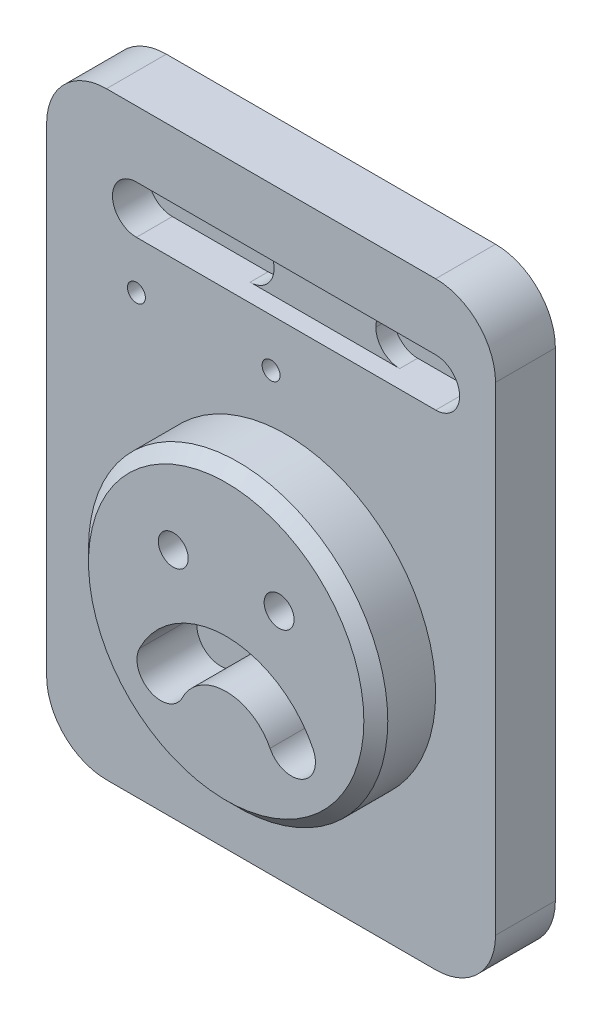
ISO-10303-21;
HEADER;
FILE_DESCRIPTION(('STEP AP214'),'2;1');
FILE_NAME('part.step','',(''),(''),'','','');
FILE_SCHEMA(('AUTOMOTIVE_DESIGN { 1 0 10303 214 1 1 1 1 }'));
ENDSEC;
DATA;
#1=APPLICATION_CONTEXT('core data for automotive mechanical design processes');
#2=APPLICATION_PROTOCOL_DEFINITION('international standard','automotive_design',2000,#1);
#3=PRODUCT_CONTEXT('',#1,'mechanical');
#4=PRODUCT('Part','Part','',(#3));
#5=PRODUCT_RELATED_PRODUCT_CATEGORY('part','',(#4));
#6=PRODUCT_DEFINITION_FORMATION('','',#4);
#7=PRODUCT_DEFINITION_CONTEXT('part definition',#1,'design');
#8=PRODUCT_DEFINITION('design','',#6,#7);
#9=PRODUCT_DEFINITION_SHAPE('','',#8);
#10=(LENGTH_UNIT() NAMED_UNIT(*) SI_UNIT(.MILLI.,.METRE.));
#11=(NAMED_UNIT(*) PLANE_ANGLE_UNIT() SI_UNIT($,.RADIAN.));
#12=(NAMED_UNIT(*) SI_UNIT($,.STERADIAN.) SOLID_ANGLE_UNIT());
#13=UNCERTAINTY_MEASURE_WITH_UNIT(LENGTH_MEASURE(1.E-05),#10,'distance_accuracy_value','');
#14=(GEOMETRIC_REPRESENTATION_CONTEXT(3) GLOBAL_UNCERTAINTY_ASSIGNED_CONTEXT((#13)) GLOBAL_UNIT_ASSIGNED_CONTEXT((#10,
#11,#12)) REPRESENTATION_CONTEXT('',''));
#15=CARTESIAN_POINT('',(0.,0.,0.));
#16=DIRECTION('',(0.,0.,1.));
#17=DIRECTION('',(1.,0.,0.));
#18=AXIS2_PLACEMENT_3D('',#15,#16,#17);
#19=CARTESIAN_POINT('',(15.,89.,4.));
#20=DIRECTION('',(0.,1.,0.));
#21=DIRECTION('',(-1.,0.,0.));
#22=AXIS2_PLACEMENT_3D('',#19,#20,#21);
#23=PLANE('',#22);
#24=DIRECTION('',(-1.,0.,0.));
#25=VECTOR('',#24,1.);
#26=CARTESIAN_POINT('',(35.,89.,7.));
#27=LINE('',#26,#25);
#28=CARTESIAN_POINT('',(56.,89.,7.));
#29=VERTEX_POINT('',#28);
#30=CARTESIAN_POINT('',(31.,89.,7.));
#31=VERTEX_POINT('',#30);
#32=EDGE_CURVE('E242',#29,#31,#27,.T.);
#33=ORIENTED_EDGE('',*,*,#32,.F.);
#34=DIRECTION('',(0.,0.,-1.));
#35=VECTOR('',#34,1.);
#36=CARTESIAN_POINT('',(56.,89.,4.));
#37=LINE('',#36,#35);
#38=CARTESIAN_POINT('',(56.,89.,4.));
#39=VERTEX_POINT('',#38);
#40=EDGE_CURVE('E388',#29,#39,#37,.T.);
#41=ORIENTED_EDGE('',*,*,#40,.T.);
#42=DIRECTION('',(-1.,0.,0.));
#43=VECTOR('',#42,1.);
#44=CARTESIAN_POINT('',(15.,89.,4.));
#45=LINE('',#44,#43);
#46=CARTESIAN_POINT('',(65.,89.,4.));
#47=VERTEX_POINT('',#46);
#48=EDGE_CURVE('E272',#47,#39,#45,.T.);
#49=ORIENTED_EDGE('',*,*,#48,.F.);
#50=DIRECTION('',(0.,0.,1.));
#51=VECTOR('',#50,1.);
#52=CARTESIAN_POINT('',(65.,89.,4.));
#53=LINE('',#52,#51);
#54=CARTESIAN_POINT('',(65.,89.,10.));
#55=VERTEX_POINT('',#54);
#56=EDGE_CURVE('E292',#47,#55,#53,.T.);
#57=ORIENTED_EDGE('',*,*,#56,.T.);
#58=DIRECTION('',(-1.,0.,0.));
#59=VECTOR('',#58,1.);
#60=CARTESIAN_POINT('',(15.,89.,10.));
#61=LINE('',#60,#59);
#62=CARTESIAN_POINT('',(15.,89.,10.));
#63=VERTEX_POINT('',#62);
#64=EDGE_CURVE('E264',#55,#63,#61,.T.);
#65=ORIENTED_EDGE('',*,*,#64,.T.);
#66=DIRECTION('',(0.,0.,1.));
#67=VECTOR('',#66,1.);
#68=CARTESIAN_POINT('',(15.,89.,4.));
#69=LINE('',#68,#67);
#70=CARTESIAN_POINT('',(15.,89.,4.));
#71=VERTEX_POINT('',#70);
#72=EDGE_CURVE('E289',#71,#63,#69,.T.);
#73=ORIENTED_EDGE('',*,*,#72,.F.);
#74=CARTESIAN_POINT('',(31.,89.,4.));
#75=VERTEX_POINT('',#74);
#76=EDGE_CURVE('E271',#75,#71,#45,.T.);
#77=ORIENTED_EDGE('',*,*,#76,.F.);
#78=DIRECTION('',(0.,0.,-1.));
#79=VECTOR('',#78,1.);
#80=CARTESIAN_POINT('',(31.,89.,7.));
#81=LINE('',#80,#79);
#82=EDGE_CURVE('E385',#75,#31,#81,.F.);
#83=ORIENTED_EDGE('',*,*,#82,.T.);
#84=EDGE_LOOP('',(#33,#41,#49,#57,#65,#73,#77,#83));
#85=FACE_BOUND('',#84,.T.);
#86=ADVANCED_FACE('F45',(#85),#23,.F.);
#87=CARTESIAN_POINT('',(15.,81.,4.));
#88=DIRECTION('',(0.,-1.,0.));
#89=DIRECTION('',(0.,0.,-1.));
#90=AXIS2_PLACEMENT_3D('',#87,#88,#89);
#91=PLANE('',#90);
#92=DIRECTION('',(1.,0.,0.));
#93=VECTOR('',#92,1.);
#94=CARTESIAN_POINT('',(15.,81.,4.));
#95=LINE('',#94,#93);
#96=CARTESIAN_POINT('',(56.,81.,4.));
#97=VERTEX_POINT('',#96);
#98=CARTESIAN_POINT('',(65.,81.,4.));
#99=VERTEX_POINT('',#98);
#100=EDGE_CURVE('E263',#97,#99,#95,.T.);
#101=ORIENTED_EDGE('',*,*,#100,.F.);
#102=DIRECTION('',(0.,0.,-1.));
#103=VECTOR('',#102,1.);
#104=CARTESIAN_POINT('',(56.,81.,7.));
#105=LINE('',#104,#103);
#106=CARTESIAN_POINT('',(56.,81.,7.));
#107=VERTEX_POINT('',#106);
#108=EDGE_CURVE('E382',#97,#107,#105,.F.);
#109=ORIENTED_EDGE('',*,*,#108,.T.);
#110=DIRECTION('',(1.,0.,0.));
#111=VECTOR('',#110,1.);
#112=CARTESIAN_POINT('',(35.,81.,7.));
#113=LINE('',#112,#111);
#114=CARTESIAN_POINT('',(31.,81.,7.));
#115=VERTEX_POINT('',#114);
#116=EDGE_CURVE('E240',#115,#107,#113,.T.);
#117=ORIENTED_EDGE('',*,*,#116,.F.);
#118=DIRECTION('',(0.,0.,-1.));
#119=VECTOR('',#118,1.);
#120=CARTESIAN_POINT('',(31.,81.,4.));
#121=LINE('',#120,#119);
#122=CARTESIAN_POINT('',(31.,81.,4.));
#123=VERTEX_POINT('',#122);
#124=EDGE_CURVE('E379',#115,#123,#121,.T.);
#125=ORIENTED_EDGE('',*,*,#124,.T.);
#126=CARTESIAN_POINT('',(15.,81.,4.));
#127=VERTEX_POINT('',#126);
#128=EDGE_CURVE('E265',#127,#123,#95,.T.);
#129=ORIENTED_EDGE('',*,*,#128,.F.);
#130=DIRECTION('',(0.,0.,1.));
#131=VECTOR('',#130,1.);
#132=CARTESIAN_POINT('',(15.,81.,4.));
#133=LINE('',#132,#131);
#134=CARTESIAN_POINT('',(15.,81.,10.));
#135=VERTEX_POINT('',#134);
#136=EDGE_CURVE('E275',#127,#135,#133,.T.);
#137=ORIENTED_EDGE('',*,*,#136,.T.);
#138=DIRECTION('',(1.,0.,0.));
#139=VECTOR('',#138,1.);
#140=CARTESIAN_POINT('',(15.,81.,10.));
#141=LINE('',#140,#139);
#142=CARTESIAN_POINT('',(65.,81.,10.));
#143=VERTEX_POINT('',#142);
#144=EDGE_CURVE('E278',#135,#143,#141,.T.);
#145=ORIENTED_EDGE('',*,*,#144,.T.);
#146=DIRECTION('',(0.,0.,1.));
#147=VECTOR('',#146,1.);
#148=CARTESIAN_POINT('',(65.,81.,4.));
#149=LINE('',#148,#147);
#150=EDGE_CURVE('E294',#99,#143,#149,.T.);
#151=ORIENTED_EDGE('',*,*,#150,.F.);
#152=EDGE_LOOP('',(#101,#109,#117,#125,#129,#137,#145,#151));
#153=FACE_BOUND('',#152,.T.);
#154=ADVANCED_FACE('F425',(#153),#91,.F.);
#155=CARTESIAN_POINT('',(15.,85.,4.));
#156=DIRECTION('',(0.,0.,1.));
#157=DIRECTION('',(1.,0.,0.));
#158=AXIS2_PLACEMENT_3D('',#155,#156,#157);
#159=PLANE('',#158);
#160=ORIENTED_EDGE('',*,*,#128,.T.);
#161=CARTESIAN_POINT('',(31.,85.,4.));
#162=DIRECTION('',(0.,0.,1.));
#163=DIRECTION('',(1.,0.,0.));
#164=AXIS2_PLACEMENT_3D('',#161,#162,#163);
#165=CIRCLE('',#164,4.);
#166=CARTESIAN_POINT('',(35.,85.,4.));
#167=VERTEX_POINT('',#166);
#168=EDGE_CURVE('E392',#123,#167,#165,.T.);
#169=ORIENTED_EDGE('',*,*,#168,.T.);
#170=CARTESIAN_POINT('',(31.,85.,4.));
#171=DIRECTION('',(0.,0.,1.));
#172=DIRECTION('',(1.,0.,0.));
#173=AXIS2_PLACEMENT_3D('',#170,#171,#172);
#174=CIRCLE('',#173,4.);
#175=EDGE_CURVE('E390',#167,#75,#174,.T.);
#176=ORIENTED_EDGE('',*,*,#175,.T.);
#177=ORIENTED_EDGE('',*,*,#76,.T.);
#178=CARTESIAN_POINT('',(15.,85.,4.));
#179=DIRECTION('',(0.,0.,1.));
#180=DIRECTION('',(1.,0.,0.));
#181=AXIS2_PLACEMENT_3D('',#178,#179,#180);
#182=CIRCLE('',#181,3.99999999999999);
#183=EDGE_CURVE('E260',#71,#127,#182,.T.);
#184=ORIENTED_EDGE('',*,*,#183,.T.);
#185=EDGE_LOOP('',(#160,#169,#176,#177,#184));
#186=FACE_BOUND('',#185,.T.);
#187=ADVANCED_FACE('F431',(#186),#159,.T.);
#188=CARTESIAN_POINT('',(56.,85.,4.));
#189=DIRECTION('',(0.,0.,1.));
#190=DIRECTION('',(1.,0.,0.));
#191=AXIS2_PLACEMENT_3D('',#188,#189,#190);
#192=CIRCLE('',#191,4.);
#193=CARTESIAN_POINT('',(52.,85.,4.));
#194=VERTEX_POINT('',#193);
#195=EDGE_CURVE('E375',#39,#194,#192,.T.);
#196=ORIENTED_EDGE('',*,*,#195,.T.);
#197=CARTESIAN_POINT('',(56.,85.,4.));
#198=DIRECTION('',(0.,0.,1.));
#199=DIRECTION('',(1.,0.,0.));
#200=AXIS2_PLACEMENT_3D('',#197,#198,#199);
#201=CIRCLE('',#200,4.);
#202=EDGE_CURVE('E377',#194,#97,#201,.T.);
#203=ORIENTED_EDGE('',*,*,#202,.T.);
#204=ORIENTED_EDGE('',*,*,#100,.T.);
#205=CARTESIAN_POINT('',(65.,85.,4.));
#206=DIRECTION('',(0.,0.,1.));
#207=DIRECTION('',(1.,0.,0.));
#208=AXIS2_PLACEMENT_3D('',#205,#206,#207);
#209=CIRCLE('',#208,4.);
#210=EDGE_CURVE('E268',#99,#47,#209,.T.);
#211=ORIENTED_EDGE('',*,*,#210,.T.);
#212=ORIENTED_EDGE('',*,*,#48,.T.);
#213=EDGE_LOOP('',(#196,#203,#204,#211,#212));
#214=FACE_BOUND('',#213,.T.);
#215=ADVANCED_FACE('F483',(#214),#159,.T.);
#216=CARTESIAN_POINT('',(0.,0.,10.));
#217=DIRECTION('',(1.,0.,0.));
#218=DIRECTION('',(0.,0.,-1.));
#219=AXIS2_PLACEMENT_3D('',#216,#217,#218);
#220=PLANE('',#219);
#221=DIRECTION('',(0.,-1.,0.));
#222=VECTOR('',#221,1.);
#223=CARTESIAN_POINT('',(0.,0.,0.));
#224=LINE('',#223,#222);
#225=CARTESIAN_POINT('',(0.,90.,0.));
#226=VERTEX_POINT('',#225);
#227=CARTESIAN_POINT('',(0.,10.,0.));
#228=VERTEX_POINT('',#227);
#229=EDGE_CURVE('E311',#226,#228,#224,.T.);
#230=ORIENTED_EDGE('',*,*,#229,.T.);
#231=DIRECTION('',(0.,0.,-1.));
#232=VECTOR('',#231,1.);
#233=CARTESIAN_POINT('',(0.,10.,10.));
#234=LINE('',#233,#232);
#235=CARTESIAN_POINT('',(0.,10.,10.));
#236=VERTEX_POINT('',#235);
#237=EDGE_CURVE('E351',#228,#236,#234,.F.);
#238=ORIENTED_EDGE('',*,*,#237,.T.);
#239=DIRECTION('',(0.,-1.,0.));
#240=VECTOR('',#239,1.);
#241=CARTESIAN_POINT('',(0.,0.,10.));
#242=LINE('',#241,#240);
#243=CARTESIAN_POINT('',(0.,90.,10.));
#244=VERTEX_POINT('',#243);
#245=EDGE_CURVE('E317',#244,#236,#242,.T.);
#246=ORIENTED_EDGE('',*,*,#245,.F.);
#247=DIRECTION('',(0.,0.,-1.));
#248=VECTOR('',#247,1.);
#249=CARTESIAN_POINT('',(0.,90.,10.));
#250=LINE('',#249,#248);
#251=EDGE_CURVE('E348',#244,#226,#250,.T.);
#252=ORIENTED_EDGE('',*,*,#251,.T.);
#253=EDGE_LOOP('',(#230,#238,#246,#252));
#254=FACE_BOUND('',#253,.T.);
#255=ADVANCED_FACE('F479',(#254),#220,.F.);
#256=CARTESIAN_POINT('',(0.,0.,10.));
#257=DIRECTION('',(0.,1.,0.));
#258=DIRECTION('',(0.,0.,1.));
#259=AXIS2_PLACEMENT_3D('',#256,#257,#258);
#260=PLANE('',#259);
#261=DIRECTION('',(1.,0.,0.));
#262=VECTOR('',#261,1.);
#263=CARTESIAN_POINT('',(0.,0.,10.));
#264=LINE('',#263,#262);
#265=CARTESIAN_POINT('',(10.,0.,10.));
#266=VERTEX_POINT('',#265);
#267=CARTESIAN_POINT('',(65.,0.,10.));
#268=VERTEX_POINT('',#267);
#269=EDGE_CURVE('E321',#266,#268,#264,.T.);
#270=ORIENTED_EDGE('',*,*,#269,.F.);
#271=DIRECTION('',(0.,0.,-1.));
#272=VECTOR('',#271,1.);
#273=CARTESIAN_POINT('',(10.,0.,10.));
#274=LINE('',#273,#272);
#275=CARTESIAN_POINT('',(10.,0.,0.));
#276=VERTEX_POINT('',#275);
#277=EDGE_CURVE('E332',#266,#276,#274,.T.);
#278=ORIENTED_EDGE('',*,*,#277,.T.);
#279=DIRECTION('',(1.,0.,0.));
#280=VECTOR('',#279,1.);
#281=CARTESIAN_POINT('',(0.,0.,0.));
#282=LINE('',#281,#280);
#283=CARTESIAN_POINT('',(65.,0.,0.));
#284=VERTEX_POINT('',#283);
#285=EDGE_CURVE('E557',#276,#284,#282,.T.);
#286=ORIENTED_EDGE('',*,*,#285,.T.);
#287=DIRECTION('',(0.,0.,-1.));
#288=VECTOR('',#287,1.);
#289=CARTESIAN_POINT('',(65.,0.,10.));
#290=LINE('',#289,#288);
#291=EDGE_CURVE('E315',#284,#268,#290,.F.);
#292=ORIENTED_EDGE('',*,*,#291,.T.);
#293=EDGE_LOOP('',(#270,#278,#286,#292));
#294=FACE_BOUND('',#293,.T.);
#295=ADVANCED_FACE('F475',(#294),#260,.F.);
#296=CARTESIAN_POINT('',(75.,0.,10.));
#297=DIRECTION('',(-1.,0.,0.));
#298=DIRECTION('',(0.,0.,1.));
#299=AXIS2_PLACEMENT_3D('',#296,#297,#298);
#300=PLANE('',#299);
#301=DIRECTION('',(0.,1.,0.));
#302=VECTOR('',#301,1.);
#303=CARTESIAN_POINT('',(75.,0.,10.));
#304=LINE('',#303,#302);
#305=CARTESIAN_POINT('',(75.,10.,10.));
#306=VERTEX_POINT('',#305);
#307=CARTESIAN_POINT('',(75.,90.,10.));
#308=VERTEX_POINT('',#307);
#309=EDGE_CURVE('E327',#306,#308,#304,.T.);
#310=ORIENTED_EDGE('',*,*,#309,.F.);
#311=DIRECTION('',(0.,0.,-1.));
#312=VECTOR('',#311,1.);
#313=CARTESIAN_POINT('',(75.,10.,10.));
#314=LINE('',#313,#312);
#315=CARTESIAN_POINT('',(75.,10.,0.));
#316=VERTEX_POINT('',#315);
#317=EDGE_CURVE('E367',#306,#316,#314,.T.);
#318=ORIENTED_EDGE('',*,*,#317,.T.);
#319=DIRECTION('',(0.,1.,0.));
#320=VECTOR('',#319,1.);
#321=CARTESIAN_POINT('',(75.,0.,0.));
#322=LINE('',#321,#320);
#323=CARTESIAN_POINT('',(75.,90.,0.));
#324=VERTEX_POINT('',#323);
#325=EDGE_CURVE('E563',#316,#324,#322,.T.);
#326=ORIENTED_EDGE('',*,*,#325,.T.);
#327=DIRECTION('',(0.,0.,-1.));
#328=VECTOR('',#327,1.);
#329=CARTESIAN_POINT('',(75.,90.,10.));
#330=LINE('',#329,#328);
#331=EDGE_CURVE('E365',#324,#308,#330,.F.);
#332=ORIENTED_EDGE('',*,*,#331,.T.);
#333=EDGE_LOOP('',(#310,#318,#326,#332));
#334=FACE_BOUND('',#333,.T.);
#335=ADVANCED_FACE('F471',(#334),#300,.F.);
#336=CARTESIAN_POINT('',(0.,100.,10.));
#337=DIRECTION('',(0.,-1.,0.));
#338=DIRECTION('',(0.,0.,-1.));
#339=AXIS2_PLACEMENT_3D('',#336,#337,#338);
#340=PLANE('',#339);
#341=DIRECTION('',(-1.,0.,0.));
#342=VECTOR('',#341,1.);
#343=CARTESIAN_POINT('',(0.,100.,10.));
#344=LINE('',#343,#342);
#345=CARTESIAN_POINT('',(65.,100.,10.));
#346=VERTEX_POINT('',#345);
#347=CARTESIAN_POINT('',(10.,100.,10.));
#348=VERTEX_POINT('',#347);
#349=EDGE_CURVE('E316',#346,#348,#344,.T.);
#350=ORIENTED_EDGE('',*,*,#349,.F.);
#351=DIRECTION('',(0.,0.,-1.));
#352=VECTOR('',#351,1.);
#353=CARTESIAN_POINT('',(65.,100.,10.));
#354=LINE('',#353,#352);
#355=CARTESIAN_POINT('',(65.,100.,0.));
#356=VERTEX_POINT('',#355);
#357=EDGE_CURVE('E372',#346,#356,#354,.T.);
#358=ORIENTED_EDGE('',*,*,#357,.T.);
#359=DIRECTION('',(-1.,0.,0.));
#360=VECTOR('',#359,1.);
#361=CARTESIAN_POINT('',(0.,100.,0.));
#362=LINE('',#361,#360);
#363=CARTESIAN_POINT('',(10.,100.,0.));
#364=VERTEX_POINT('',#363);
#365=EDGE_CURVE('E322',#356,#364,#362,.T.);
#366=ORIENTED_EDGE('',*,*,#365,.T.);
#367=DIRECTION('',(0.,0.,-1.));
#368=VECTOR('',#367,1.);
#369=CARTESIAN_POINT('',(10.,100.,10.));
#370=LINE('',#369,#368);
#371=EDGE_CURVE('E370',#364,#348,#370,.F.);
#372=ORIENTED_EDGE('',*,*,#371,.T.);
#373=EDGE_LOOP('',(#350,#358,#366,#372));
#374=FACE_BOUND('',#373,.T.);
#375=ADVANCED_FACE('F464',(#374),#340,.F.);
#376=CARTESIAN_POINT('',(0.,0.,10.));
#377=DIRECTION('',(0.,0.,-1.));
#378=DIRECTION('',(-1.,0.,0.));
#379=AXIS2_PLACEMENT_3D('',#376,#377,#378);
#380=PLANE('',#379);
#381=CARTESIAN_POINT('',(15.,73.,10.));
#382=DIRECTION('',(0.,0.,1.));
#383=DIRECTION('',(1.,0.,0.));
#384=AXIS2_PLACEMENT_3D('',#381,#382,#383);
#385=CIRCLE('',#384,1.5);
#386=CARTESIAN_POINT('',(16.5,73.,10.));
#387=VERTEX_POINT('',#386);
#388=EDGE_CURVE('E245',#387,#387,#385,.T.);
#389=ORIENTED_EDGE('',*,*,#388,.F.);
#390=EDGE_LOOP('',(#389));
#391=FACE_BOUND('',#390,.T.);
#392=CARTESIAN_POINT('',(37.5,73.,10.));
#393=DIRECTION('',(0.,0.,1.));
#394=DIRECTION('',(1.,0.,0.));
#395=AXIS2_PLACEMENT_3D('',#392,#393,#394);
#396=CIRCLE('',#395,1.5);
#397=CARTESIAN_POINT('',(39.,73.,10.));
#398=VERTEX_POINT('',#397);
#399=EDGE_CURVE('E252',#398,#398,#396,.T.);
#400=ORIENTED_EDGE('',*,*,#399,.F.);
#401=EDGE_LOOP('',(#400));
#402=FACE_BOUND('',#401,.T.);
#403=ORIENTED_EDGE('',*,*,#144,.F.);
#404=CARTESIAN_POINT('',(15.,85.,10.));
#405=DIRECTION('',(0.,0.,1.));
#406=DIRECTION('',(1.,0.,0.));
#407=AXIS2_PLACEMENT_3D('',#404,#405,#406);
#408=CIRCLE('',#407,3.99999999999999);
#409=EDGE_CURVE('E259',#63,#135,#408,.T.);
#410=ORIENTED_EDGE('',*,*,#409,.F.);
#411=ORIENTED_EDGE('',*,*,#64,.F.);
#412=CARTESIAN_POINT('',(65.,85.,10.));
#413=DIRECTION('',(0.,0.,1.));
#414=DIRECTION('',(1.,0.,0.));
#415=AXIS2_PLACEMENT_3D('',#412,#413,#414);
#416=CIRCLE('',#415,4.);
#417=EDGE_CURVE('E282',#143,#55,#416,.T.);
#418=ORIENTED_EDGE('',*,*,#417,.F.);
#419=EDGE_LOOP('',(#403,#410,#411,#418));
#420=FACE_BOUND('',#419,.T.);
#421=CARTESIAN_POINT('',(40.,40.,10.));
#422=DIRECTION('',(0.,0.,1.));
#423=DIRECTION('',(1.,0.,0.));
#424=AXIS2_PLACEMENT_3D('',#421,#422,#423);
#425=CIRCLE('',#424,25.);
#426=CARTESIAN_POINT('',(65.,40.,10.));
#427=VERTEX_POINT('',#426);
#428=EDGE_CURVE('E312',#427,#427,#425,.T.);
#429=ORIENTED_EDGE('',*,*,#428,.F.);
#430=EDGE_LOOP('',(#429));
#431=FACE_BOUND('',#430,.T.);
#432=ORIENTED_EDGE('',*,*,#245,.T.);
#433=CARTESIAN_POINT('',(10.,10.,10.));
#434=DIRECTION('',(0.,0.,-1.));
#435=DIRECTION('',(-1.,0.,0.));
#436=AXIS2_PLACEMENT_3D('',#433,#434,#435);
#437=CIRCLE('',#436,10.);
#438=EDGE_CURVE('E362',#236,#266,#437,.F.);
#439=ORIENTED_EDGE('',*,*,#438,.T.);
#440=ORIENTED_EDGE('',*,*,#269,.T.);
#441=CARTESIAN_POINT('',(65.,10.,10.));
#442=DIRECTION('',(0.,0.,-1.));
#443=DIRECTION('',(-1.,0.,0.));
#444=AXIS2_PLACEMENT_3D('',#441,#442,#443);
#445=CIRCLE('',#444,10.);
#446=EDGE_CURVE('E359',#268,#306,#445,.F.);
#447=ORIENTED_EDGE('',*,*,#446,.T.);
#448=ORIENTED_EDGE('',*,*,#309,.T.);
#449=CARTESIAN_POINT('',(65.,90.,10.));
#450=DIRECTION('',(0.,0.,-1.));
#451=DIRECTION('',(-1.,0.,0.));
#452=AXIS2_PLACEMENT_3D('',#449,#450,#451);
#453=CIRCLE('',#452,10.);
#454=EDGE_CURVE('E356',#308,#346,#453,.F.);
#455=ORIENTED_EDGE('',*,*,#454,.T.);
#456=ORIENTED_EDGE('',*,*,#349,.T.);
#457=CARTESIAN_POINT('',(10.,90.,10.));
#458=DIRECTION('',(0.,0.,-1.));
#459=DIRECTION('',(-1.,0.,0.));
#460=AXIS2_PLACEMENT_3D('',#457,#458,#459);
#461=CIRCLE('',#460,10.);
#462=EDGE_CURVE('E353',#348,#244,#461,.F.);
#463=ORIENTED_EDGE('',*,*,#462,.T.);
#464=EDGE_LOOP('',(#432,#439,#440,#447,#448,#455,#456,#463));
#465=FACE_BOUND('',#464,.T.);
#466=ADVANCED_FACE('F461',(#391,#402,#420,#431,#465),#380,.F.);
#467=CARTESIAN_POINT('',(0.,0.,0.));
#468=DIRECTION('',(0.,0.,-1.));
#469=DIRECTION('',(-1.,0.,0.));
#470=AXIS2_PLACEMENT_3D('',#467,#468,#469);
#471=PLANE('',#470);
#472=CARTESIAN_POINT('',(15.,73.,0.));
#473=DIRECTION('',(0.,0.,1.));
#474=DIRECTION('',(1.,0.,0.));
#475=AXIS2_PLACEMENT_3D('',#472,#473,#474);
#476=CIRCLE('',#475,1.5);
#477=CARTESIAN_POINT('',(16.5,73.,0.));
#478=VERTEX_POINT('',#477);
#479=EDGE_CURVE('E249',#478,#478,#476,.T.);
#480=ORIENTED_EDGE('',*,*,#479,.T.);
#481=EDGE_LOOP('',(#480));
#482=FACE_BOUND('',#481,.T.);
#483=CARTESIAN_POINT('',(37.5,73.,0.));
#484=DIRECTION('',(0.,0.,1.));
#485=DIRECTION('',(1.,0.,0.));
#486=AXIS2_PLACEMENT_3D('',#483,#484,#485);
#487=CIRCLE('',#486,1.49999999999999);
#488=CARTESIAN_POINT('',(39.,73.,0.));
#489=VERTEX_POINT('',#488);
#490=EDGE_CURVE('E256',#489,#489,#487,.T.);
#491=ORIENTED_EDGE('',*,*,#490,.T.);
#492=EDGE_LOOP('',(#491));
#493=FACE_BOUND('',#492,.T.);
#494=CARTESIAN_POINT('',(31.1611652351681,48.8388347648318,0.));
#495=DIRECTION('',(0.,0.,1.));
#496=DIRECTION('',(1.,0.,0.));
#497=AXIS2_PLACEMENT_3D('',#494,#495,#496);
#498=CIRCLE('',#497,2.5);
#499=CARTESIAN_POINT('',(33.6611652351681,48.8388347648318,0.));
#500=VERTEX_POINT('',#499);
#501=EDGE_CURVE('E301',#500,#500,#498,.T.);
#502=ORIENTED_EDGE('',*,*,#501,.T.);
#503=EDGE_LOOP('',(#502));
#504=FACE_BOUND('',#503,.T.);
#505=CARTESIAN_POINT('',(48.8388347648318,48.8388347648319,0.));
#506=DIRECTION('',(0.,0.,1.));
#507=DIRECTION('',(1.,0.,0.));
#508=AXIS2_PLACEMENT_3D('',#505,#506,#507);
#509=CIRCLE('',#508,2.5);
#510=CARTESIAN_POINT('',(51.3388347648318,48.8388347648319,0.));
#511=VERTEX_POINT('',#510);
#512=EDGE_CURVE('E308',#511,#511,#509,.T.);
#513=ORIENTED_EDGE('',*,*,#512,.T.);
#514=EDGE_LOOP('',(#513));
#515=FACE_BOUND('',#514,.T.);
#516=ORIENTED_EDGE('',*,*,#285,.F.);
#517=CARTESIAN_POINT('',(10.,10.,0.));
#518=DIRECTION('',(0.,0.,-1.));
#519=DIRECTION('',(-1.,0.,0.));
#520=AXIS2_PLACEMENT_3D('',#517,#518,#519);
#521=CIRCLE('',#520,10.);
#522=EDGE_CURVE('E346',#276,#228,#521,.T.);
#523=ORIENTED_EDGE('',*,*,#522,.T.);
#524=ORIENTED_EDGE('',*,*,#229,.F.);
#525=CARTESIAN_POINT('',(10.,90.,0.));
#526=DIRECTION('',(0.,0.,-1.));
#527=DIRECTION('',(-1.,0.,0.));
#528=AXIS2_PLACEMENT_3D('',#525,#526,#527);
#529=CIRCLE('',#528,10.);
#530=EDGE_CURVE('E338',#226,#364,#529,.T.);
#531=ORIENTED_EDGE('',*,*,#530,.T.);
#532=ORIENTED_EDGE('',*,*,#365,.F.);
#533=CARTESIAN_POINT('',(65.,90.,0.));
#534=DIRECTION('',(0.,0.,-1.));
#535=DIRECTION('',(-1.,0.,0.));
#536=AXIS2_PLACEMENT_3D('',#533,#534,#535);
#537=CIRCLE('',#536,10.);
#538=EDGE_CURVE('E342',#356,#324,#537,.T.);
#539=ORIENTED_EDGE('',*,*,#538,.T.);
#540=ORIENTED_EDGE('',*,*,#325,.F.);
#541=CARTESIAN_POINT('',(65.,10.,0.));
#542=DIRECTION('',(0.,0.,-1.));
#543=DIRECTION('',(-1.,0.,0.));
#544=AXIS2_PLACEMENT_3D('',#541,#542,#543);
#545=CIRCLE('',#544,10.);
#546=EDGE_CURVE('E344',#316,#284,#545,.T.);
#547=ORIENTED_EDGE('',*,*,#546,.T.);
#548=EDGE_LOOP('',(#516,#523,#524,#531,#532,#539,#540,#547));
#549=FACE_BOUND('',#548,.T.);
#550=ADVANCED_FACE('F459',(#482,#493,#504,#515,#549),#471,.T.);
#551=CARTESIAN_POINT('',(40.,40.,20.));
#552=DIRECTION('',(0.,0.,-1.));
#553=DIRECTION('',(-1.,0.,0.));
#554=AXIS2_PLACEMENT_3D('',#551,#552,#553);
#555=CYLINDRICAL_SURFACE('',#554,25.);
#556=CARTESIAN_POINT('',(40.,40.,18.));
#557=DIRECTION('',(0.,0.,1.));
#558=DIRECTION('',(1.,0.,0.));
#559=AXIS2_PLACEMENT_3D('',#556,#557,#558);
#560=CIRCLE('',#559,25.);
#561=CARTESIAN_POINT('',(65.,40.,18.));
#562=VERTEX_POINT('',#561);
#563=EDGE_CURVE('E12',#562,#562,#560,.F.);
#564=ORIENTED_EDGE('',*,*,#563,.T.);
#565=EDGE_LOOP('',(#564));
#566=FACE_BOUND('',#565,.T.);
#567=ORIENTED_EDGE('',*,*,#428,.T.);
#568=EDGE_LOOP('',(#567));
#569=FACE_BOUND('',#568,.T.);
#570=ADVANCED_FACE('F456',(#566,#569),#555,.T.);
#571=CARTESIAN_POINT('',(40.,40.,20.));
#572=DIRECTION('',(0.,0.,1.));
#573=DIRECTION('',(1.,0.,0.));
#574=AXIS2_PLACEMENT_3D('',#571,#572,#573);
#575=PLANE('',#574);
#576=CARTESIAN_POINT('',(40.,40.,20.));
#577=DIRECTION('',(0.,0.,1.));
#578=DIRECTION('',(1.,0.,0.));
#579=AXIS2_PLACEMENT_3D('',#576,#577,#578);
#580=CIRCLE('',#579,23.);
#581=CARTESIAN_POINT('',(63.,40.,20.));
#582=VERTEX_POINT('',#581);
#583=EDGE_CURVE('E55',#582,#582,#580,.T.);
#584=ORIENTED_EDGE('',*,*,#583,.T.);
#585=EDGE_LOOP('',(#584));
#586=FACE_BOUND('',#585,.T.);
#587=CARTESIAN_POINT('',(50.9109120140918,29.9880693506236,20.));
#588=DIRECTION('',(0.,0.,1.));
#589=DIRECTION('',(1.,0.,0.));
#590=AXIS2_PLACEMENT_3D('',#587,#588,#589);
#591=CIRCLE('',#590,3.99999999999999);
#592=CARTESIAN_POINT('',(47.3232005095803,28.2193618676304,20.));
#593=VERTEX_POINT('',#592);
#594=CARTESIAN_POINT('',(54.4986235186032,31.7567768336168,20.));
#595=VERTEX_POINT('',#594);
#596=EDGE_CURVE('E62',#593,#595,#591,.T.);
#597=ORIENTED_EDGE('',*,*,#596,.F.);
#598=CARTESIAN_POINT('',(40.,24.6090940062188,20.));
#599=DIRECTION('',(0.,0.,-1.));
#600=DIRECTION('',(1.,0.,0.));
#601=AXIS2_PLACEMENT_3D('',#598,#599,#600);
#602=CIRCLE('',#601,8.16475962503852);
#603=CARTESIAN_POINT('',(32.6767994904196,28.2193618676304,20.));
#604=VERTEX_POINT('',#603);
#605=EDGE_CURVE('E217',#604,#593,#602,.T.);
#606=ORIENTED_EDGE('',*,*,#605,.F.);
#607=CARTESIAN_POINT('',(29.0890879859082,29.9880693506236,20.));
#608=DIRECTION('',(0.,0.,1.));
#609=DIRECTION('',(1.,0.,0.));
#610=AXIS2_PLACEMENT_3D('',#607,#608,#609);
#611=CIRCLE('',#610,3.99999999999999);
#612=CARTESIAN_POINT('',(25.5013764813968,31.7567768336168,20.));
#613=VERTEX_POINT('',#612);
#614=EDGE_CURVE('E221',#613,#604,#611,.T.);
#615=ORIENTED_EDGE('',*,*,#614,.F.);
#616=CARTESIAN_POINT('',(40.,24.6090940062188,20.));
#617=DIRECTION('',(0.,0.,1.));
#618=DIRECTION('',(1.,0.,0.));
#619=AXIS2_PLACEMENT_3D('',#616,#617,#618);
#620=CIRCLE('',#619,16.1647596250385);
#621=EDGE_CURVE('E228',#595,#613,#620,.T.);
#622=ORIENTED_EDGE('',*,*,#621,.F.);
#623=EDGE_LOOP('',(#597,#606,#615,#622));
#624=FACE_BOUND('',#623,.T.);
#625=CARTESIAN_POINT('',(31.1611652351681,48.8388347648318,20.));
#626=DIRECTION('',(0.,0.,1.));
#627=DIRECTION('',(1.,0.,0.));
#628=AXIS2_PLACEMENT_3D('',#625,#626,#627);
#629=CIRCLE('',#628,2.5);
#630=CARTESIAN_POINT('',(33.6611652351681,48.8388347648318,20.));
#631=VERTEX_POINT('',#630);
#632=EDGE_CURVE('E291',#631,#631,#629,.T.);
#633=ORIENTED_EDGE('',*,*,#632,.F.);
#634=EDGE_LOOP('',(#633));
#635=FACE_BOUND('',#634,.T.);
#636=CARTESIAN_POINT('',(48.8388347648318,48.8388347648319,20.));
#637=DIRECTION('',(0.,0.,1.));
#638=DIRECTION('',(1.,0.,0.));
#639=AXIS2_PLACEMENT_3D('',#636,#637,#638);
#640=CIRCLE('',#639,2.5);
#641=CARTESIAN_POINT('',(51.3388347648318,48.8388347648319,20.));
#642=VERTEX_POINT('',#641);
#643=EDGE_CURVE('E304',#642,#642,#640,.T.);
#644=ORIENTED_EDGE('',*,*,#643,.F.);
#645=EDGE_LOOP('',(#644));
#646=FACE_BOUND('',#645,.T.);
#647=ADVANCED_FACE('F414',(#586,#624,#635,#646),#575,.T.);
#648=CARTESIAN_POINT('',(48.8388347648318,48.8388347648319,20.));
#649=DIRECTION('',(0.,0.,1.));
#650=DIRECTION('',(1.,0.,0.));
#651=AXIS2_PLACEMENT_3D('',#648,#649,#650);
#652=CYLINDRICAL_SURFACE('',#651,2.5);
#653=ORIENTED_EDGE('',*,*,#512,.F.);
#654=EDGE_LOOP('',(#653));
#655=FACE_BOUND('',#654,.T.);
#656=ORIENTED_EDGE('',*,*,#643,.T.);
#657=EDGE_LOOP('',(#656));
#658=FACE_BOUND('',#657,.T.);
#659=ADVANCED_FACE('F449',(#655,#658),#652,.F.);
#660=CARTESIAN_POINT('',(31.1611652351681,48.8388347648318,20.));
#661=DIRECTION('',(0.,0.,1.));
#662=DIRECTION('',(1.,0.,0.));
#663=AXIS2_PLACEMENT_3D('',#660,#661,#662);
#664=CYLINDRICAL_SURFACE('',#663,2.5);
#665=ORIENTED_EDGE('',*,*,#501,.F.);
#666=EDGE_LOOP('',(#665));
#667=FACE_BOUND('',#666,.T.);
#668=ORIENTED_EDGE('',*,*,#632,.T.);
#669=EDGE_LOOP('',(#668));
#670=FACE_BOUND('',#669,.T.);
#671=ADVANCED_FACE('F445',(#667,#670),#664,.F.);
#672=CARTESIAN_POINT('',(15.,85.,4.));
#673=DIRECTION('',(0.,0.,1.));
#674=DIRECTION('',(1.,0.,0.));
#675=AXIS2_PLACEMENT_3D('',#672,#673,#674);
#676=CYLINDRICAL_SURFACE('',#675,3.99999999999999);
#677=ORIENTED_EDGE('',*,*,#409,.T.);
#678=ORIENTED_EDGE('',*,*,#136,.F.);
#679=ORIENTED_EDGE('',*,*,#183,.F.);
#680=ORIENTED_EDGE('',*,*,#72,.T.);
#681=EDGE_LOOP('',(#677,#678,#679,#680));
#682=FACE_BOUND('',#681,.T.);
#683=ADVANCED_FACE('F440',(#682),#676,.F.);
#684=CARTESIAN_POINT('',(65.,85.,4.));
#685=DIRECTION('',(0.,0.,1.));
#686=DIRECTION('',(1.,0.,0.));
#687=AXIS2_PLACEMENT_3D('',#684,#685,#686);
#688=CYLINDRICAL_SURFACE('',#687,4.);
#689=ORIENTED_EDGE('',*,*,#417,.T.);
#690=ORIENTED_EDGE('',*,*,#56,.F.);
#691=ORIENTED_EDGE('',*,*,#210,.F.);
#692=ORIENTED_EDGE('',*,*,#150,.T.);
#693=EDGE_LOOP('',(#689,#690,#691,#692));
#694=FACE_BOUND('',#693,.T.);
#695=ADVANCED_FACE('F437',(#694),#688,.F.);
#696=CARTESIAN_POINT('',(10.,10.,10.));
#697=DIRECTION('',(0.,0.,-1.));
#698=DIRECTION('',(-1.,0.,0.));
#699=AXIS2_PLACEMENT_3D('',#696,#697,#698);
#700=CYLINDRICAL_SURFACE('',#699,10.);
#701=ORIENTED_EDGE('',*,*,#438,.F.);
#702=ORIENTED_EDGE('',*,*,#237,.F.);
#703=ORIENTED_EDGE('',*,*,#522,.F.);
#704=ORIENTED_EDGE('',*,*,#277,.F.);
#705=EDGE_LOOP('',(#701,#702,#703,#704));
#706=FACE_BOUND('',#705,.T.);
#707=ADVANCED_FACE('F439',(#706),#700,.T.);
#708=CARTESIAN_POINT('',(65.,10.,10.));
#709=DIRECTION('',(0.,0.,-1.));
#710=DIRECTION('',(-1.,0.,0.));
#711=AXIS2_PLACEMENT_3D('',#708,#709,#710);
#712=CYLINDRICAL_SURFACE('',#711,10.);
#713=ORIENTED_EDGE('',*,*,#446,.F.);
#714=ORIENTED_EDGE('',*,*,#291,.F.);
#715=ORIENTED_EDGE('',*,*,#546,.F.);
#716=ORIENTED_EDGE('',*,*,#317,.F.);
#717=EDGE_LOOP('',(#713,#714,#715,#716));
#718=FACE_BOUND('',#717,.T.);
#719=ADVANCED_FACE('F487',(#718),#712,.T.);
#720=CARTESIAN_POINT('',(65.,90.,10.));
#721=DIRECTION('',(0.,0.,-1.));
#722=DIRECTION('',(-1.,0.,0.));
#723=AXIS2_PLACEMENT_3D('',#720,#721,#722);
#724=CYLINDRICAL_SURFACE('',#723,10.);
#725=ORIENTED_EDGE('',*,*,#454,.F.);
#726=ORIENTED_EDGE('',*,*,#331,.F.);
#727=ORIENTED_EDGE('',*,*,#538,.F.);
#728=ORIENTED_EDGE('',*,*,#357,.F.);
#729=EDGE_LOOP('',(#725,#726,#727,#728));
#730=FACE_BOUND('',#729,.T.);
#731=ADVANCED_FACE('F491',(#730),#724,.T.);
#732=CARTESIAN_POINT('',(10.,90.,10.));
#733=DIRECTION('',(0.,0.,-1.));
#734=DIRECTION('',(-1.,0.,0.));
#735=AXIS2_PLACEMENT_3D('',#732,#733,#734);
#736=CYLINDRICAL_SURFACE('',#735,10.);
#737=ORIENTED_EDGE('',*,*,#462,.F.);
#738=ORIENTED_EDGE('',*,*,#371,.F.);
#739=ORIENTED_EDGE('',*,*,#530,.F.);
#740=ORIENTED_EDGE('',*,*,#251,.F.);
#741=EDGE_LOOP('',(#737,#738,#739,#740));
#742=FACE_BOUND('',#741,.T.);
#743=ADVANCED_FACE('F495',(#742),#736,.T.);
#744=CARTESIAN_POINT('',(37.5,73.,10.));
#745=DIRECTION('',(0.,0.,1.));
#746=DIRECTION('',(1.,0.,0.));
#747=AXIS2_PLACEMENT_3D('',#744,#745,#746);
#748=CYLINDRICAL_SURFACE('',#747,1.5);
#749=ORIENTED_EDGE('',*,*,#490,.F.);
#750=EDGE_LOOP('',(#749));
#751=FACE_BOUND('',#750,.T.);
#752=ORIENTED_EDGE('',*,*,#399,.T.);
#753=EDGE_LOOP('',(#752));
#754=FACE_BOUND('',#753,.T.);
#755=ADVANCED_FACE('F499',(#751,#754),#748,.F.);
#756=CARTESIAN_POINT('',(15.,73.,10.));
#757=DIRECTION('',(0.,0.,1.));
#758=DIRECTION('',(1.,0.,0.));
#759=AXIS2_PLACEMENT_3D('',#756,#757,#758);
#760=CYLINDRICAL_SURFACE('',#759,1.5);
#761=ORIENTED_EDGE('',*,*,#479,.F.);
#762=EDGE_LOOP('',(#761));
#763=FACE_BOUND('',#762,.T.);
#764=ORIENTED_EDGE('',*,*,#388,.T.);
#765=EDGE_LOOP('',(#764));
#766=FACE_BOUND('',#765,.T.);
#767=ADVANCED_FACE('F730',(#763,#766),#760,.F.);
#768=CARTESIAN_POINT('',(0.,0.,7.));
#769=DIRECTION('',(0.,0.,1.));
#770=DIRECTION('',(1.,0.,0.));
#771=AXIS2_PLACEMENT_3D('',#768,#769,#770);
#772=PLANE('',#771);
#773=ORIENTED_EDGE('',*,*,#32,.T.);
#774=CARTESIAN_POINT('',(31.,85.,7.));
#775=DIRECTION('',(0.,0.,1.));
#776=DIRECTION('',(1.,0.,0.));
#777=AXIS2_PLACEMENT_3D('',#774,#775,#776);
#778=CIRCLE('',#777,4.);
#779=CARTESIAN_POINT('',(35.,85.,7.));
#780=VERTEX_POINT('',#779);
#781=EDGE_CURVE('E70',#31,#780,#778,.F.);
#782=ORIENTED_EDGE('',*,*,#781,.T.);
#783=CARTESIAN_POINT('',(31.,85.,7.));
#784=DIRECTION('',(0.,0.,1.));
#785=DIRECTION('',(1.,0.,0.));
#786=AXIS2_PLACEMENT_3D('',#783,#784,#785);
#787=CIRCLE('',#786,4.);
#788=EDGE_CURVE('E401',#780,#115,#787,.F.);
#789=ORIENTED_EDGE('',*,*,#788,.T.);
#790=ORIENTED_EDGE('',*,*,#116,.T.);
#791=CARTESIAN_POINT('',(56.,85.,7.));
#792=DIRECTION('',(0.,0.,1.));
#793=DIRECTION('',(1.,0.,0.));
#794=AXIS2_PLACEMENT_3D('',#791,#792,#793);
#795=CIRCLE('',#794,4.);
#796=CARTESIAN_POINT('',(52.,85.,7.));
#797=VERTEX_POINT('',#796);
#798=EDGE_CURVE('E394',#107,#797,#795,.F.);
#799=ORIENTED_EDGE('',*,*,#798,.T.);
#800=CARTESIAN_POINT('',(56.,85.,7.));
#801=DIRECTION('',(0.,0.,1.));
#802=DIRECTION('',(1.,0.,0.));
#803=AXIS2_PLACEMENT_3D('',#800,#801,#802);
#804=CIRCLE('',#803,4.);
#805=EDGE_CURVE('E397',#797,#29,#804,.F.);
#806=ORIENTED_EDGE('',*,*,#805,.T.);
#807=EDGE_LOOP('',(#773,#782,#789,#790,#799,#806));
#808=FACE_BOUND('',#807,.T.);
#809=ADVANCED_FACE('F509',(#808),#772,.T.);
#810=CARTESIAN_POINT('',(56.,85.,4.));
#811=DIRECTION('',(0.,0.,1.));
#812=DIRECTION('',(1.,0.,0.));
#813=AXIS2_PLACEMENT_3D('',#810,#811,#812);
#814=CYLINDRICAL_SURFACE('',#813,4.);
#815=ORIENTED_EDGE('',*,*,#40,.F.);
#816=ORIENTED_EDGE('',*,*,#805,.F.);
#817=DIRECTION('',(0.,0.,-1.));
#818=VECTOR('',#817,1.);
#819=CARTESIAN_POINT('',(52.,85.,7.));
#820=LINE('',#819,#818);
#821=EDGE_CURVE('E243',#194,#797,#820,.F.);
#822=ORIENTED_EDGE('',*,*,#821,.F.);
#823=ORIENTED_EDGE('',*,*,#195,.F.);
#824=EDGE_LOOP('',(#815,#816,#822,#823));
#825=FACE_BOUND('',#824,.T.);
#826=ADVANCED_FACE('F505',(#825),#814,.F.);
#827=CARTESIAN_POINT('',(56.,85.,7.));
#828=DIRECTION('',(0.,0.,1.));
#829=DIRECTION('',(1.,0.,0.));
#830=AXIS2_PLACEMENT_3D('',#827,#828,#829);
#831=CYLINDRICAL_SURFACE('',#830,4.);
#832=ORIENTED_EDGE('',*,*,#798,.F.);
#833=ORIENTED_EDGE('',*,*,#108,.F.);
#834=ORIENTED_EDGE('',*,*,#202,.F.);
#835=ORIENTED_EDGE('',*,*,#821,.T.);
#836=EDGE_LOOP('',(#832,#833,#834,#835));
#837=FACE_BOUND('',#836,.T.);
#838=ADVANCED_FACE('F501',(#837),#831,.F.);
#839=CARTESIAN_POINT('',(31.,85.,7.));
#840=DIRECTION('',(0.,0.,1.));
#841=DIRECTION('',(1.,0.,0.));
#842=AXIS2_PLACEMENT_3D('',#839,#840,#841);
#843=CYLINDRICAL_SURFACE('',#842,4.);
#844=DIRECTION('',(0.,0.,-1.));
#845=VECTOR('',#844,1.);
#846=CARTESIAN_POINT('',(35.,85.,4.));
#847=LINE('',#846,#845);
#848=EDGE_CURVE('E236',#780,#167,#847,.T.);
#849=ORIENTED_EDGE('',*,*,#848,.F.);
#850=ORIENTED_EDGE('',*,*,#781,.F.);
#851=ORIENTED_EDGE('',*,*,#82,.F.);
#852=ORIENTED_EDGE('',*,*,#175,.F.);
#853=EDGE_LOOP('',(#849,#850,#851,#852));
#854=FACE_BOUND('',#853,.T.);
#855=ADVANCED_FACE('F504',(#854),#843,.F.);
#856=CARTESIAN_POINT('',(31.,85.,4.));
#857=DIRECTION('',(0.,0.,1.));
#858=DIRECTION('',(1.,0.,0.));
#859=AXIS2_PLACEMENT_3D('',#856,#857,#858);
#860=CYLINDRICAL_SURFACE('',#859,4.);
#861=ORIENTED_EDGE('',*,*,#788,.F.);
#862=ORIENTED_EDGE('',*,*,#848,.T.);
#863=ORIENTED_EDGE('',*,*,#168,.F.);
#864=ORIENTED_EDGE('',*,*,#124,.F.);
#865=EDGE_LOOP('',(#861,#862,#863,#864));
#866=FACE_BOUND('',#865,.T.);
#867=ADVANCED_FACE('F511',(#866),#860,.F.);
#868=CARTESIAN_POINT('',(50.9109120140918,29.9880693506236,10.));
#869=DIRECTION('',(0.,0.,1.));
#870=DIRECTION('',(1.,0.,0.));
#871=AXIS2_PLACEMENT_3D('',#868,#869,#870);
#872=CYLINDRICAL_SURFACE('',#871,3.99999999999999);
#873=ORIENTED_EDGE('',*,*,#596,.T.);
#874=DIRECTION('',(0.,0.,1.));
#875=VECTOR('',#874,1.);
#876=CARTESIAN_POINT('',(54.4986235186032,31.7567768336168,10.));
#877=LINE('',#876,#875);
#878=CARTESIAN_POINT('',(54.4986235186032,31.7567768336168,10.));
#879=VERTEX_POINT('',#878);
#880=EDGE_CURVE('E195',#879,#595,#877,.T.);
#881=ORIENTED_EDGE('',*,*,#880,.F.);
#882=CARTESIAN_POINT('',(50.9109120140918,29.9880693506236,10.));
#883=DIRECTION('',(0.,0.,1.));
#884=DIRECTION('',(1.,0.,0.));
#885=AXIS2_PLACEMENT_3D('',#882,#883,#884);
#886=CIRCLE('',#885,3.99999999999999);
#887=CARTESIAN_POINT('',(47.3232005095803,28.2193618676304,10.));
#888=VERTEX_POINT('',#887);
#889=EDGE_CURVE('E199',#888,#879,#886,.T.);
#890=ORIENTED_EDGE('',*,*,#889,.F.);
#891=DIRECTION('',(0.,0.,1.));
#892=VECTOR('',#891,1.);
#893=CARTESIAN_POINT('',(47.3232005095803,28.2193618676304,10.));
#894=LINE('',#893,#892);
#895=EDGE_CURVE('E234',#888,#593,#894,.T.);
#896=ORIENTED_EDGE('',*,*,#895,.T.);
#897=EDGE_LOOP('',(#873,#881,#890,#896));
#898=FACE_BOUND('',#897,.T.);
#899=ADVANCED_FACE('F197',(#898),#872,.F.);
#900=CARTESIAN_POINT('',(40.,24.6090940062188,10.));
#901=DIRECTION('',(0.,0.,1.));
#902=DIRECTION('',(1.,0.,0.));
#903=AXIS2_PLACEMENT_3D('',#900,#901,#902);
#904=CYLINDRICAL_SURFACE('',#903,8.16475962503852);
#905=ORIENTED_EDGE('',*,*,#605,.T.);
#906=ORIENTED_EDGE('',*,*,#895,.F.);
#907=CARTESIAN_POINT('',(40.,24.6090940062188,10.));
#908=DIRECTION('',(0.,0.,-1.));
#909=DIRECTION('',(1.,0.,0.));
#910=AXIS2_PLACEMENT_3D('',#907,#908,#909);
#911=CIRCLE('',#910,8.16475962503852);
#912=CARTESIAN_POINT('',(32.6767994904196,28.2193618676304,10.));
#913=VERTEX_POINT('',#912);
#914=EDGE_CURVE('E205',#913,#888,#911,.T.);
#915=ORIENTED_EDGE('',*,*,#914,.F.);
#916=DIRECTION('',(0.,0.,1.));
#917=VECTOR('',#916,1.);
#918=CARTESIAN_POINT('',(32.6767994904196,28.2193618676304,10.));
#919=LINE('',#918,#917);
#920=EDGE_CURVE('E237',#913,#604,#919,.T.);
#921=ORIENTED_EDGE('',*,*,#920,.T.);
#922=EDGE_LOOP('',(#905,#906,#915,#921));
#923=FACE_BOUND('',#922,.T.);
#924=ADVANCED_FACE('F736',(#923),#904,.T.);
#925=CARTESIAN_POINT('',(29.0890879859082,29.9880693506236,10.));
#926=DIRECTION('',(0.,0.,1.));
#927=DIRECTION('',(1.,0.,0.));
#928=AXIS2_PLACEMENT_3D('',#925,#926,#927);
#929=CYLINDRICAL_SURFACE('',#928,3.99999999999999);
#930=ORIENTED_EDGE('',*,*,#614,.T.);
#931=ORIENTED_EDGE('',*,*,#920,.F.);
#932=CARTESIAN_POINT('',(29.0890879859082,29.9880693506236,10.));
#933=DIRECTION('',(0.,0.,1.));
#934=DIRECTION('',(1.,0.,0.));
#935=AXIS2_PLACEMENT_3D('',#932,#933,#934);
#936=CIRCLE('',#935,3.99999999999999);
#937=CARTESIAN_POINT('',(25.5013764813968,31.7567768336168,10.));
#938=VERTEX_POINT('',#937);
#939=EDGE_CURVE('E213',#938,#913,#936,.T.);
#940=ORIENTED_EDGE('',*,*,#939,.F.);
#941=DIRECTION('',(0.,0.,1.));
#942=VECTOR('',#941,1.);
#943=CARTESIAN_POINT('',(25.5013764813968,31.7567768336168,10.));
#944=LINE('',#943,#942);
#945=EDGE_CURVE('E204',#938,#613,#944,.T.);
#946=ORIENTED_EDGE('',*,*,#945,.T.);
#947=EDGE_LOOP('',(#930,#931,#940,#946));
#948=FACE_BOUND('',#947,.T.);
#949=ADVANCED_FACE('F741',(#948),#929,.F.);
#950=CARTESIAN_POINT('',(40.,24.6090940062188,10.));
#951=DIRECTION('',(0.,0.,1.));
#952=DIRECTION('',(1.,0.,0.));
#953=AXIS2_PLACEMENT_3D('',#950,#951,#952);
#954=CYLINDRICAL_SURFACE('',#953,16.1647596250385);
#955=ORIENTED_EDGE('',*,*,#621,.T.);
#956=ORIENTED_EDGE('',*,*,#945,.F.);
#957=CARTESIAN_POINT('',(40.,24.6090940062188,10.));
#958=DIRECTION('',(0.,0.,1.));
#959=DIRECTION('',(1.,0.,0.));
#960=AXIS2_PLACEMENT_3D('',#957,#958,#959);
#961=CIRCLE('',#960,16.1647596250385);
#962=EDGE_CURVE('E208',#879,#938,#961,.T.);
#963=ORIENTED_EDGE('',*,*,#962,.F.);
#964=ORIENTED_EDGE('',*,*,#880,.T.);
#965=EDGE_LOOP('',(#955,#956,#963,#964));
#966=FACE_BOUND('',#965,.T.);
#967=ADVANCED_FACE('F209',(#966),#954,.F.);
#968=CARTESIAN_POINT('',(45.4554560070459,27.2985816784212,10.));
#969=DIRECTION('',(0.,0.,1.));
#970=DIRECTION('',(1.,0.,0.));
#971=AXIS2_PLACEMENT_3D('',#968,#969,#970);
#972=PLANE('',#971);
#973=ORIENTED_EDGE('',*,*,#889,.T.);
#974=ORIENTED_EDGE('',*,*,#962,.T.);
#975=ORIENTED_EDGE('',*,*,#939,.T.);
#976=ORIENTED_EDGE('',*,*,#914,.T.);
#977=EDGE_LOOP('',(#973,#974,#975,#976));
#978=FACE_BOUND('',#977,.T.);
#979=ADVANCED_FACE('F215',(#978),#972,.T.);
#980=CARTESIAN_POINT('',(40.,40.,20.));
#981=DIRECTION('',(0.,0.,-1.));
#982=DIRECTION('',(-1.,0.,0.));
#983=AXIS2_PLACEMENT_3D('',#980,#981,#982);
#984=CONICAL_SURFACE('',#983,23.,0.785398163397447);
#985=ORIENTED_EDGE('',*,*,#563,.F.);
#986=EDGE_LOOP('',(#985));
#987=FACE_BOUND('',#986,.T.);
#988=ORIENTED_EDGE('',*,*,#583,.F.);
#989=EDGE_LOOP('',(#988));
#990=FACE_BOUND('',#989,.T.);
#991=ADVANCED_FACE('F48',(#987,#990),#984,.T.);
#992=CLOSED_SHELL('',(#86,#154,#187,#215,#255,#295,#335,#375,#466,#550,#570,#647,#659,#671,#683,
#695,#707,#719,#731,#743,#755,#767,#809,#826,#838,#855,#867,#899,#924,#949,#967,#979,#991));
#993=MANIFOLD_SOLID_BREP('B2',#992);
#994=ADVANCED_BREP_SHAPE_REPRESENTATION('',(#18,#993),#14);
#995=SHAPE_DEFINITION_REPRESENTATION(#9,#994);
ENDSEC;
END-ISO-10303-21;
